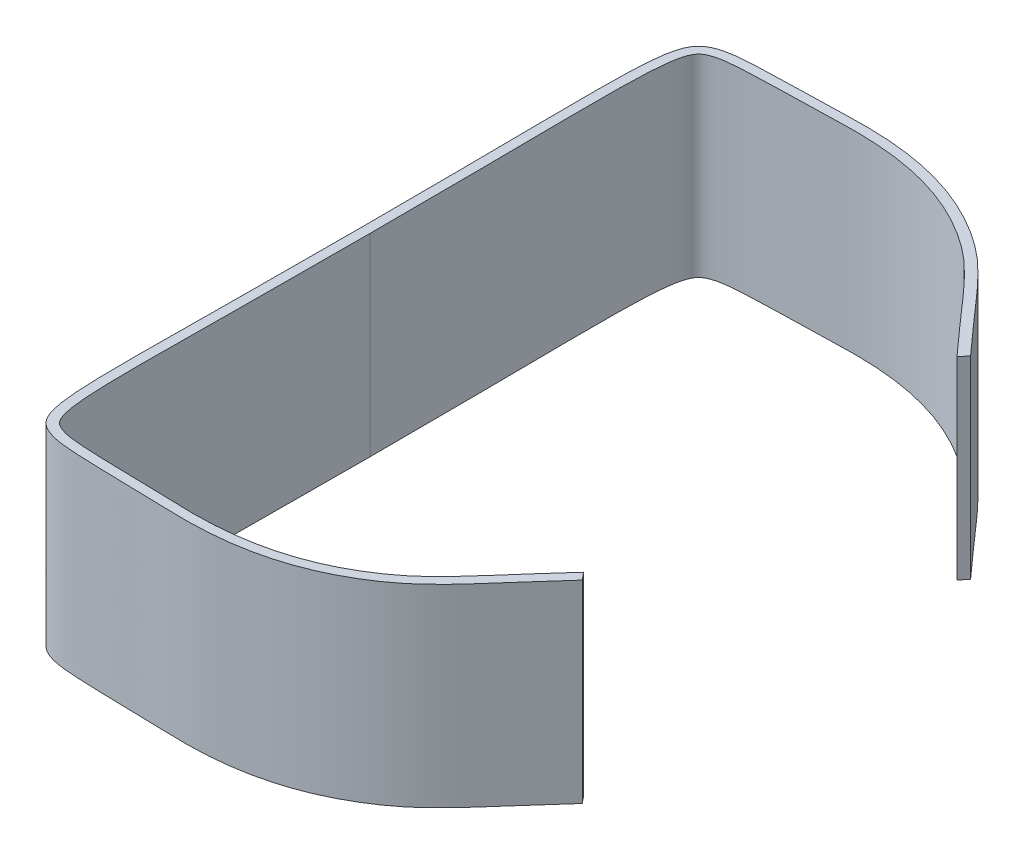
ISO-10303-21;
HEADER;
FILE_DESCRIPTION(('STEP AP214'),'2;1');
FILE_NAME('part.step','',(''),(''),'','','');
FILE_SCHEMA(('AUTOMOTIVE_DESIGN { 1 0 10303 214 1 1 1 1 }'));
ENDSEC;
DATA;
#1=APPLICATION_CONTEXT('core data for automotive mechanical design processes');
#2=APPLICATION_PROTOCOL_DEFINITION('international standard','automotive_design',2000,#1);
#3=PRODUCT_CONTEXT('',#1,'mechanical');
#4=PRODUCT('Part','Part','',(#3));
#5=PRODUCT_RELATED_PRODUCT_CATEGORY('part','',(#4));
#6=PRODUCT_DEFINITION_FORMATION('','',#4);
#7=PRODUCT_DEFINITION_CONTEXT('part definition',#1,'design');
#8=PRODUCT_DEFINITION('design','',#6,#7);
#9=PRODUCT_DEFINITION_SHAPE('','',#8);
#10=(LENGTH_UNIT() NAMED_UNIT(*) SI_UNIT(.MILLI.,.METRE.));
#11=(NAMED_UNIT(*) PLANE_ANGLE_UNIT() SI_UNIT($,.RADIAN.));
#12=(NAMED_UNIT(*) SI_UNIT($,.STERADIAN.) SOLID_ANGLE_UNIT());
#13=UNCERTAINTY_MEASURE_WITH_UNIT(LENGTH_MEASURE(1.E-05),#10,'distance_accuracy_value','');
#14=(GEOMETRIC_REPRESENTATION_CONTEXT(3) GLOBAL_UNCERTAINTY_ASSIGNED_CONTEXT((#13)) GLOBAL_UNIT_ASSIGNED_CONTEXT((#10,
#11,#12)) REPRESENTATION_CONTEXT('',''));
#15=CARTESIAN_POINT('',(0.,0.,0.));
#16=DIRECTION('',(0.,0.,1.));
#17=DIRECTION('',(1.,0.,0.));
#18=AXIS2_PLACEMENT_3D('',#15,#16,#17);
#19=CARTESIAN_POINT('',(-104.500278868593,248.550791860705,25.0692667372049));
#20=CARTESIAN_POINT('',(-104.500278868593,248.550791860705,86.2203708964296));
#21=CARTESIAN_POINT('',(-106.793117411586,248.550791860705,93.287202236139));
#22=CARTESIAN_POINT('',(-95.172272758296,248.550791860705,95.9433669146563));
#23=CARTESIAN_POINT('',(-79.469262305786,248.550791860705,96.0744979903922));
#24=CARTESIAN_POINT('',(-63.6660410291015,248.550791860705,96.7855223457146));
#25=CARTESIAN_POINT('',(-48.6034000240585,248.550791860705,94.7613497732437));
#26=CARTESIAN_POINT('',(-29.9398456370186,248.550791860705,81.0140021476635));
#27=CARTESIAN_POINT('',(-19.658840998879,248.550791860705,67.0507910474507));
#28=CARTESIAN_POINT('',(7.05130162676777,248.550791860705,41.9454729868186));
#29=CARTESIAN_POINT('',(5.29005501714887,248.550791860705,40.069266737205));
#30=CARTESIAN_POINT('',(31.3497211314067,248.550791860705,40.069266737205));
#31=B_SPLINE_CURVE_WITH_KNOTS('',3,(#19,#20,#21,#22,#23,#24,#25,#26,#27,#28,#29,#30),
.UNSPECIFIED.,.F.,.F.,(4,1,1,1,1,1,1,1,1,4),(0.,0.317927937374036,0.363507051006273,
0.445537349065021,0.481032646359293,0.682964726654727,0.721703648076661,0.829682939156698,
0.858862315487532,1.),.UNSPECIFIED.);
#32=DIRECTION('',(0.,-1.,0.));
#33=VECTOR('',#32,1.);
#34=SURFACE_OF_LINEAR_EXTRUSION('',#31,#33);
#35=CARTESIAN_POINT('',(-104.500278868593,0.,25.0692667372049));
#36=CARTESIAN_POINT('',(-104.500278868593,0.,86.2203708964296));
#37=CARTESIAN_POINT('',(-106.793117411586,0.,93.287202236139));
#38=CARTESIAN_POINT('',(-95.172272758296,0.,95.9433669146563));
#39=CARTESIAN_POINT('',(-79.469262305786,0.,96.0744979903922));
#40=CARTESIAN_POINT('',(-63.6660410291015,0.,96.7855223457146));
#41=CARTESIAN_POINT('',(-48.6034000240585,0.,94.7613497732437));
#42=CARTESIAN_POINT('',(-29.9398456370186,0.,81.0140021476635));
#43=CARTESIAN_POINT('',(-19.658840998879,0.,67.0507910474507));
#44=CARTESIAN_POINT('',(7.05130162676777,0.,41.9454729868186));
#45=CARTESIAN_POINT('',(5.29005501714887,0.,40.069266737205));
#46=CARTESIAN_POINT('',(31.3497211314067,0.,40.069266737205));
#47=B_SPLINE_CURVE_WITH_KNOTS('',3,(#35,#36,#37,#38,#39,#40,#41,#42,#43,#44,#45,#46),
.UNSPECIFIED.,.F.,.F.,(4,1,1,1,1,1,1,1,1,4),(0.,0.317927937374036,0.363507051006273,
0.445537349065021,0.481032646359293,0.682964726654727,0.721703648076661,0.829682939156698,
0.858862315487532,1.),.UNSPECIFIED.);
#48=CARTESIAN_POINT('',(-104.500278868593,0.,25.0692667372049));
#49=VERTEX_POINT('',#48);
#50=CARTESIAN_POINT('',(-17.4457507161834,0.,65.7048659966111));
#51=VERTEX_POINT('',#50);
#52=EDGE_CURVE('E110',#49,#51,#47,.T.);
#53=ORIENTED_EDGE('',*,*,#52,.T.);
#54=DIRECTION('',(0.,-1.,0.));
#55=VECTOR('',#54,1.);
#56=CARTESIAN_POINT('',(-17.4457507161834,20.25,65.7048659966111));
#57=LINE('',#56,#55);
#58=CARTESIAN_POINT('',(-17.4457507161834,40.5,65.7048659966111));
#59=VERTEX_POINT('',#58);
#60=EDGE_CURVE('E104',#51,#59,#57,.F.);
#61=ORIENTED_EDGE('',*,*,#60,.T.);
#62=CARTESIAN_POINT('',(-104.500278868593,40.5,25.0692667372049));
#63=CARTESIAN_POINT('',(-104.500278868593,40.5,86.2203708964296));
#64=CARTESIAN_POINT('',(-106.793117411586,40.5,93.287202236139));
#65=CARTESIAN_POINT('',(-95.172272758296,40.5,95.9433669146563));
#66=CARTESIAN_POINT('',(-79.469262305786,40.5,96.0744979903922));
#67=CARTESIAN_POINT('',(-63.6660410291015,40.5,96.7855223457146));
#68=CARTESIAN_POINT('',(-48.6034000240585,40.5,94.7613497732437));
#69=CARTESIAN_POINT('',(-29.9398456370186,40.5,81.0140021476635));
#70=CARTESIAN_POINT('',(-19.658840998879,40.5,67.0507910474507));
#71=CARTESIAN_POINT('',(7.05130162676777,40.5,41.9454729868186));
#72=CARTESIAN_POINT('',(5.29005501714887,40.5,40.069266737205));
#73=CARTESIAN_POINT('',(31.3497211314067,40.5,40.069266737205));
#74=B_SPLINE_CURVE_WITH_KNOTS('',3,(#62,#63,#64,#65,#66,#67,#68,#69,#70,#71,#72,#73),
.UNSPECIFIED.,.F.,.F.,(4,1,1,1,1,1,1,1,1,4),(0.,0.317927937374036,0.363507051006273,
0.445537349065021,0.481032646359293,0.682964726654727,0.721703648076661,0.829682939156698,
0.858862315487532,1.),.UNSPECIFIED.);
#75=CARTESIAN_POINT('',(-104.500278868593,40.5,25.0692667372051));
#76=VERTEX_POINT('',#75);
#77=EDGE_CURVE('E138',#76,#59,#74,.T.);
#78=ORIENTED_EDGE('',*,*,#77,.F.);
#79=DIRECTION('',(0.,-1.,0.));
#80=VECTOR('',#79,1.);
#81=CARTESIAN_POINT('',(-104.500278868593,248.550791860705,25.0692667372049));
#82=LINE('',#81,#80);
#83=EDGE_CURVE('E113',#76,#49,#82,.T.);
#84=ORIENTED_EDGE('',*,*,#83,.T.);
#85=EDGE_LOOP('',(#53,#61,#78,#84));
#86=FACE_BOUND('',#85,.T.);
#87=ADVANCED_FACE('F38',(#86),#34,.F.);
#88=CARTESIAN_POINT('',(31.3497211314067,248.550791860705,10.069266737205));
#89=CARTESIAN_POINT('',(5.29005501714887,248.550791860705,10.069266737205));
#90=CARTESIAN_POINT('',(7.05130162676776,248.550791860705,8.19306048759136));
#91=CARTESIAN_POINT('',(-19.658840998879,248.550791860705,-16.9122575730407));
#92=CARTESIAN_POINT('',(-29.9398456370186,248.550791860705,-30.8754686732535));
#93=CARTESIAN_POINT('',(-48.6034000240585,248.550791860705,-44.6228162988337));
#94=CARTESIAN_POINT('',(-63.6660410291015,248.550791860705,-46.6469888713046));
#95=CARTESIAN_POINT('',(-79.469262305786,248.550791860705,-45.9359645159822));
#96=CARTESIAN_POINT('',(-95.172272758296,248.550791860705,-45.8048334402463));
#97=CARTESIAN_POINT('',(-106.793117411586,248.550791860705,-43.148668761729));
#98=CARTESIAN_POINT('',(-104.500278868593,248.550791860705,-36.0818374220196));
#99=CARTESIAN_POINT('',(-104.500278868593,248.550791860705,25.0692667372051));
#100=B_SPLINE_CURVE_WITH_KNOTS('',3,(#88,#89,#90,#91,#92,#93,#94,#95,#96,#97,#98,#99),
.UNSPECIFIED.,.F.,.F.,(4,1,1,1,1,1,1,1,1,4),(0.,0.141137684512468,0.170317060843302,
0.278296351923339,0.317035273345273,0.518967353640707,0.554462650934979,0.636492948993727,
0.682072062625964,1.),.UNSPECIFIED.);
#101=DIRECTION('',(0.,-1.,0.));
#102=VECTOR('',#101,1.);
#103=SURFACE_OF_LINEAR_EXTRUSION('',#100,#102);
#104=CARTESIAN_POINT('',(31.3497211314067,40.5,10.069266737205));
#105=CARTESIAN_POINT('',(5.29005501714887,40.5,10.069266737205));
#106=CARTESIAN_POINT('',(7.05130162676776,40.5,8.19306048759136));
#107=CARTESIAN_POINT('',(-19.658840998879,40.5,-16.9122575730407));
#108=CARTESIAN_POINT('',(-29.9398456370186,40.5,-30.8754686732535));
#109=CARTESIAN_POINT('',(-48.6034000240585,40.5,-44.6228162988337));
#110=CARTESIAN_POINT('',(-63.6660410291015,40.5,-46.6469888713046));
#111=CARTESIAN_POINT('',(-79.469262305786,40.5,-45.9359645159822));
#112=CARTESIAN_POINT('',(-95.172272758296,40.5,-45.8048334402463));
#113=CARTESIAN_POINT('',(-106.793117411586,40.5,-43.148668761729));
#114=CARTESIAN_POINT('',(-104.500278868593,40.5,-36.0818374220196));
#115=CARTESIAN_POINT('',(-104.500278868593,40.5,25.0692667372051));
#116=B_SPLINE_CURVE_WITH_KNOTS('',3,(#104,#105,#106,#107,#108,#109,#110,#111,#112,#113,#114,
#115),.UNSPECIFIED.,.F.,.F.,(4,1,1,1,1,1,1,1,1,4),(0.,0.141137684512468,0.170317060843302,
0.278296351923339,0.317035273345273,0.518967353640707,0.554462650934979,0.636492948993727,
0.682072062625964,1.),.UNSPECIFIED.);
#117=CARTESIAN_POINT('',(-17.4457507161834,40.5,-15.5663325222011));
#118=VERTEX_POINT('',#117);
#119=EDGE_CURVE('E103',#118,#76,#116,.T.);
#120=ORIENTED_EDGE('',*,*,#119,.F.);
#121=DIRECTION('',(0.,-1.,0.));
#122=VECTOR('',#121,1.);
#123=CARTESIAN_POINT('',(-17.4457507161834,20.25,-15.5663325222011));
#124=LINE('',#123,#122);
#125=CARTESIAN_POINT('',(-17.4457507161834,0.,-15.5663325222011));
#126=VERTEX_POINT('',#125);
#127=EDGE_CURVE('E54',#118,#126,#124,.T.);
#128=ORIENTED_EDGE('',*,*,#127,.T.);
#129=CARTESIAN_POINT('',(31.3497211314067,0.,10.069266737205));
#130=CARTESIAN_POINT('',(5.29005501714887,0.,10.069266737205));
#131=CARTESIAN_POINT('',(7.05130162676776,0.,8.19306048759136));
#132=CARTESIAN_POINT('',(-19.658840998879,0.,-16.9122575730407));
#133=CARTESIAN_POINT('',(-29.9398456370186,0.,-30.8754686732535));
#134=CARTESIAN_POINT('',(-48.6034000240585,0.,-44.6228162988337));
#135=CARTESIAN_POINT('',(-63.6660410291015,0.,-46.6469888713046));
#136=CARTESIAN_POINT('',(-79.469262305786,0.,-45.9359645159822));
#137=CARTESIAN_POINT('',(-95.172272758296,0.,-45.8048334402463));
#138=CARTESIAN_POINT('',(-106.793117411586,0.,-43.148668761729));
#139=CARTESIAN_POINT('',(-104.500278868593,0.,-36.0818374220196));
#140=CARTESIAN_POINT('',(-104.500278868593,0.,25.0692667372051));
#141=B_SPLINE_CURVE_WITH_KNOTS('',3,(#129,#130,#131,#132,#133,#134,#135,#136,#137,#138,#139,
#140),.UNSPECIFIED.,.F.,.F.,(4,1,1,1,1,1,1,1,1,4),(0.,0.141137684512468,0.170317060843302,
0.278296351923339,0.317035273345273,0.518967353640707,0.554462650934979,0.636492948993727,
0.682072062625964,1.),.UNSPECIFIED.);
#142=EDGE_CURVE('E101',#126,#49,#141,.T.);
#143=ORIENTED_EDGE('',*,*,#142,.T.);
#144=ORIENTED_EDGE('',*,*,#83,.F.);
#145=EDGE_LOOP('',(#120,#128,#143,#144));
#146=FACE_BOUND('',#145,.T.);
#147=ADVANCED_FACE('F40',(#146),#103,.F.);
#148=CARTESIAN_POINT('',(-68.9923316694651,0.,-46.2246215981284));
#149=DIRECTION('',(0.,1.,0.));
#150=DIRECTION('',(0.,0.,1.));
#151=AXIS2_PLACEMENT_3D('',#148,#149,#150);
#152=PLANE('',#151);
#153=ORIENTED_EDGE('',*,*,#142,.F.);
#154=CARTESIAN_POINT('',(31.3497211314067,0.,25.069266737205));
#155=DIRECTION('',(0.,1.,0.));
#156=DIRECTION('',(0.,0.,1.));
#157=AXIS2_PLACEMENT_3D('',#154,#155,#156);
#158=CIRCLE('',#157,63.5);
#159=CARTESIAN_POINT('',(-18.7147392360709,0.,-13.9922207935236));
#160=VERTEX_POINT('',#159);
#161=EDGE_CURVE('E89',#126,#160,#158,.T.);
#162=ORIENTED_EDGE('',*,*,#161,.T.);
#163=CARTESIAN_POINT('',(31.3497211314067,0.,12.069266737205));
#164=CARTESIAN_POINT('',(30.6467718543112,0.,12.069266737205));
#165=CARTESIAN_POINT('',(29.2114531936166,0.,12.0668777775646));
#166=CARTESIAN_POINT('',(27.2350158500333,0.,12.0551261718132));
#167=CARTESIAN_POINT('',(25.3573795729473,0.,12.0341953276854));
#168=CARTESIAN_POINT('',(23.0040571351233,0.,11.9926774415696));
#169=CARTESIAN_POINT('',(20.3185239243081,0.,11.9126630931522));
#170=CARTESIAN_POINT('',(17.4651119758886,0.,11.76294117911));
#171=CARTESIAN_POINT('',(14.9348603645907,0.,11.5500626602896));
#172=CARTESIAN_POINT('',(11.9327593169538,0.,11.1676435596618));
#173=CARTESIAN_POINT('',(8.76339977324109,0.,10.4751316264119));
#174=CARTESIAN_POINT('',(5.59385851988909,0.,9.18832362157286));
#175=CARTESIAN_POINT('',(2.88150265345503,0.,7.41066052437564));
#176=CARTESIAN_POINT('',(0.395728613533612,0.,5.20592588600096));
#177=CARTESIAN_POINT('',(-2.23210571256994,0.,2.54756809751704));
#178=CARTESIAN_POINT('',(-5.35667563862406,0.,-0.645706558347562));
#179=CARTESIAN_POINT('',(-9.41246816280954,0.,-4.53754485598129));
#180=CARTESIAN_POINT('',(-13.7609204954448,0.,-8.75785002419778));
#181=CARTESIAN_POINT('',(-17.686786151176,0.,-12.850925112658));
#182=CARTESIAN_POINT('',(-21.2594441704765,0.,-16.7717781626167));
#183=CARTESIAN_POINT('',(-25.609260401534,0.,-21.7087772187235));
#184=CARTESIAN_POINT('',(-30.4043140668278,0.,-27.2347637484207));
#185=CARTESIAN_POINT('',(-35.4509761034591,0.,-32.402322376408));
#186=CARTESIAN_POINT('',(-40.234966672972,0.,-35.9702422205511));
#187=CARTESIAN_POINT('',(-45.0956882092921,0.,-38.7908005733552));
#188=CARTESIAN_POINT('',(-49.9382311367634,0.,-40.9204499363347));
#189=CARTESIAN_POINT('',(-54.7711390861764,0.,-42.4535611327101));
#190=CARTESIAN_POINT('',(-59.5761259023535,0.,-43.4700334528744));
#191=CARTESIAN_POINT('',(-63.5451146220021,0.,-43.9532577071498));
#192=CARTESIAN_POINT('',(-66.6901463295852,0.,-44.1607315447825));
#193=CARTESIAN_POINT('',(-69.0302854955751,0.,-44.2365159530004));
#194=CARTESIAN_POINT('',(-71.3533823716473,0.,-44.2427838054974));
#195=CARTESIAN_POINT('',(-73.6409169166751,0.,-44.1878101547645));
#196=CARTESIAN_POINT('',(-76.1321912767981,0.,-44.0974056444901));
#197=CARTESIAN_POINT('',(-79.1487937535476,0.,-44.0116046749307));
#198=CARTESIAN_POINT('',(-82.6311297644543,0.,-43.9404272923477));
#199=CARTESIAN_POINT('',(-86.2768320082327,0.,-43.8639059537216));
#200=CARTESIAN_POINT('',(-89.8290058547577,0.,-43.7688906179447));
#201=CARTESIAN_POINT('',(-93.0248270177282,0.,-43.640829485382));
#202=CARTESIAN_POINT('',(-95.5383032374088,0.,-43.467627657293));
#203=CARTESIAN_POINT('',(-97.2067048497861,0.,-43.2451850641316));
#204=CARTESIAN_POINT('',(-98.2950047185534,0.,-42.9980167354465));
#205=CARTESIAN_POINT('',(-99.1660567557545,0.,-42.7038279086618));
#206=CARTESIAN_POINT('',(-99.8641741607911,0.,-42.3894748615935));
#207=CARTESIAN_POINT('',(-100.3676620088,0.,-42.0597597200759));
#208=CARTESIAN_POINT('',(-100.764802453963,0.,-41.6822409888388));
#209=CARTESIAN_POINT('',(-101.254364747512,0.,-40.9991267202523));
#210=CARTESIAN_POINT('',(-101.853156267838,0.,-39.5166319169307));
#211=CARTESIAN_POINT('',(-102.38373617139,0.,-36.3277896355441));
#212=CARTESIAN_POINT('',(-102.679368896636,0.,-31.568606119285));
#213=CARTESIAN_POINT('',(-102.783388859365,0.,-25.0124678561875));
#214=CARTESIAN_POINT('',(-102.758141912572,0.,-17.8376665631294));
#215=CARTESIAN_POINT('',(-102.701925385238,0.,-10.9332384190125));
#216=CARTESIAN_POINT('',(-102.649578735497,0.,-5.13734486041059));
#217=CARTESIAN_POINT('',(-102.594900900551,0.,1.31172538004062));
#218=CARTESIAN_POINT('',(-102.553939485303,0.,7.25986953130089));
#219=CARTESIAN_POINT('',(-102.527860161789,0.,12.3812635229994));
#220=CARTESIAN_POINT('',(-102.512627235922,0.,16.4068986979431));
#221=CARTESIAN_POINT('',(-102.504356561132,0.,19.9238058886529));
#222=CARTESIAN_POINT('',(-102.500884757049,0.,22.8265075412887));
#223=CARTESIAN_POINT('',(-102.500278868593,0.,24.3256640897824));
#224=CARTESIAN_POINT('',(-102.500278868593,0.,25.0692667372051));
#225=B_SPLINE_CURVE_WITH_KNOTS('',3,(#163,#164,#165,#166,#167,#168,#169,#170,#171,#172,#173,
#174,#175,#176,#177,#178,#179,#180,#181,#182,#183,#184,#185,#186,#187,#188,#189,#190,#191,#192,
#193,#194,#195,#196,#197,#198,#199,#200,#201,#202,#203,#204,#205,#206,#207,#208,#209,#210,#211,
#212,#213,#214,#215,#216,#217,#218,#219,#220,#221,#222,#223,#224),.UNSPECIFIED.,.F.,.F.,(4,1,1,
1,1,1,1,1,1,1,1,1,1,1,1,1,1,1,1,1,1,1,1,1,1,1,1,1,1,1,1,1,1,1,1,1,1,1,1,1,1,1,1,1,1,1,1,1,1,1,1,
1,1,1,1,1,1,1,1,4),(0.,0.00390625,0.0078125,0.01171875,0.015625,0.0234375,0.03125,0.0390625,
0.046875,0.0625,0.078125,0.09375,0.109375,0.125,0.140625,0.15625,0.171875,0.1875,0.203125,
0.21875,0.25,0.28125,0.3125,0.34375,0.375,0.40625,0.4375,0.46875,0.484375,0.5,0.515625,0.53125,
0.546875,0.5625,0.578125,0.59375,0.609375,0.625,0.640625,0.65625,0.671875,0.6875,0.703125,
0.71875,0.734375,0.75,0.78125,0.8125,0.84375,0.875,0.90625,0.921875,0.9375,0.953125,0.96875,
0.9765625,0.984375,0.9921875,0.99609375,1.),.UNSPECIFIED.);
#226=CARTESIAN_POINT('',(-102.500278868593,0.,25.0692667372051));
#227=VERTEX_POINT('',#226);
#228=EDGE_CURVE('E116',#160,#227,#225,.T.);
#229=ORIENTED_EDGE('',*,*,#228,.T.);
#230=CARTESIAN_POINT('',(-102.500278868593,0.,25.0692667372049));
#231=CARTESIAN_POINT('',(-102.500278868593,0.,25.8128693846276));
#232=CARTESIAN_POINT('',(-102.500884757049,0.,27.3120259331213));
#233=CARTESIAN_POINT('',(-102.504356561132,0.,30.2147275857571));
#234=CARTESIAN_POINT('',(-102.512627235922,0.,33.7316347764669));
#235=CARTESIAN_POINT('',(-102.527860161789,0.,37.7572699514106));
#236=CARTESIAN_POINT('',(-102.553939485303,0.,42.8786639431091));
#237=CARTESIAN_POINT('',(-102.594900900551,0.,48.8268080943694));
#238=CARTESIAN_POINT('',(-102.649578735497,0.,55.2758783348206));
#239=CARTESIAN_POINT('',(-102.701925385238,0.,61.0717718934225));
#240=CARTESIAN_POINT('',(-102.758141912572,0.,67.9762000375394));
#241=CARTESIAN_POINT('',(-102.783388859365,0.,75.1510013305975));
#242=CARTESIAN_POINT('',(-102.679368896636,0.,81.707139593695));
#243=CARTESIAN_POINT('',(-102.38373617139,0.,86.4663231099541));
#244=CARTESIAN_POINT('',(-101.853156267838,0.,89.6551653913407));
#245=CARTESIAN_POINT('',(-101.254364747512,0.,91.1376601946623));
#246=CARTESIAN_POINT('',(-100.764802453963,0.,91.8207744632489));
#247=CARTESIAN_POINT('',(-100.3676620088,0.,92.1982931944859));
#248=CARTESIAN_POINT('',(-99.8641741607911,0.,92.5280083360036));
#249=CARTESIAN_POINT('',(-99.1660567557545,0.,92.8423613830718));
#250=CARTESIAN_POINT('',(-98.2950047185533,0.,93.1365502098566));
#251=CARTESIAN_POINT('',(-97.2067048497861,0.,93.3837185385416));
#252=CARTESIAN_POINT('',(-95.5383032374087,0.,93.606161131703));
#253=CARTESIAN_POINT('',(-93.0248270177281,0.,93.7793629597921));
#254=CARTESIAN_POINT('',(-89.8290058547577,0.,93.9074240923547));
#255=CARTESIAN_POINT('',(-86.2768320082327,0.,94.0024394281317));
#256=CARTESIAN_POINT('',(-82.6311297644543,0.,94.0789607667577));
#257=CARTESIAN_POINT('',(-79.1487937535476,0.,94.1501381493407));
#258=CARTESIAN_POINT('',(-76.1321912767981,0.,94.2359391189001));
#259=CARTESIAN_POINT('',(-73.6409169166751,0.,94.3263436291746));
#260=CARTESIAN_POINT('',(-71.3533823716473,0.,94.3813172799074));
#261=CARTESIAN_POINT('',(-69.0302854955751,0.,94.3750494274104));
#262=CARTESIAN_POINT('',(-66.6901463295852,0.,94.2992650191925));
#263=CARTESIAN_POINT('',(-63.5451146220021,0.,94.0917911815598));
#264=CARTESIAN_POINT('',(-59.5761259023535,0.,93.6085669272844));
#265=CARTESIAN_POINT('',(-54.7711390861764,0.,92.5920946071201));
#266=CARTESIAN_POINT('',(-49.9382311367634,0.,91.0589834107447));
#267=CARTESIAN_POINT('',(-45.0956882092921,0.,88.9293340477652));
#268=CARTESIAN_POINT('',(-40.234966672972,0.,86.1087756949611));
#269=CARTESIAN_POINT('',(-35.4509761034591,0.,82.5408558508179));
#270=CARTESIAN_POINT('',(-30.4043140668277,0.,77.3732972228307));
#271=CARTESIAN_POINT('',(-25.609260401534,0.,71.8473106931335));
#272=CARTESIAN_POINT('',(-21.2594441704764,0.,66.9103116370267));
#273=CARTESIAN_POINT('',(-17.686786151176,0.,62.989458587068));
#274=CARTESIAN_POINT('',(-13.7609204954448,0.,58.8963834986078));
#275=CARTESIAN_POINT('',(-9.41246816280953,0.,54.6760783303913));
#276=CARTESIAN_POINT('',(-5.35667563862406,0.,50.7842400327576));
#277=CARTESIAN_POINT('',(-2.23210571256994,0.,47.590965376893));
#278=CARTESIAN_POINT('',(0.395728613533615,0.,44.932607588409));
#279=CARTESIAN_POINT('',(2.88150265345504,0.,42.7278729500344));
#280=CARTESIAN_POINT('',(5.59385851988909,0.,40.9502098528371));
#281=CARTESIAN_POINT('',(8.7633997732411,0.,39.6634018479981));
#282=CARTESIAN_POINT('',(11.9327593169538,0.,38.9708899147482));
#283=CARTESIAN_POINT('',(14.9348603645907,0.,38.5884708141204));
#284=CARTESIAN_POINT('',(17.4651119758886,0.,38.3755922953));
#285=CARTESIAN_POINT('',(20.3185239243081,0.,38.2258703812578));
#286=CARTESIAN_POINT('',(23.0040571351233,0.,38.1458560328405));
#287=CARTESIAN_POINT('',(25.3573795729474,0.,38.1043381467246));
#288=CARTESIAN_POINT('',(27.2350158500333,0.,38.0834073025968));
#289=CARTESIAN_POINT('',(29.2114531936166,0.,38.0716556968454));
#290=CARTESIAN_POINT('',(30.6467718543112,0.,38.069266737205));
#291=CARTESIAN_POINT('',(31.3497211314067,0.,38.069266737205));
#292=B_SPLINE_CURVE_WITH_KNOTS('',3,(#230,#231,#232,#233,#234,#235,#236,#237,#238,#239,#240,
#241,#242,#243,#244,#245,#246,#247,#248,#249,#250,#251,#252,#253,#254,#255,#256,#257,#258,#259,
#260,#261,#262,#263,#264,#265,#266,#267,#268,#269,#270,#271,#272,#273,#274,#275,#276,#277,#278,
#279,#280,#281,#282,#283,#284,#285,#286,#287,#288,#289,#290,#291),.UNSPECIFIED.,.F.,.F.,(4,1,1,
1,1,1,1,1,1,1,1,1,1,1,1,1,1,1,1,1,1,1,1,1,1,1,1,1,1,1,1,1,1,1,1,1,1,1,1,1,1,1,1,1,1,1,1,1,1,1,1,
1,1,1,1,1,1,1,1,4),(0.,0.00390625,0.0078125,0.015625,0.0234375,0.03125,0.046875,0.0625,0.078125,
0.09375,0.125,0.15625,0.1875,0.21875,0.25,0.265625,0.28125,0.296875,0.3125,0.328125,0.34375,
0.359375,0.375,0.390625,0.40625,0.421875,0.4375,0.453125,0.46875,0.484375,0.5,0.515625,0.53125,
0.5625,0.59375,0.625,0.65625,0.6875,0.71875,0.75,0.78125,0.796875,0.8125,0.828125,0.84375,
0.859375,0.875,0.890625,0.90625,0.921875,0.9375,0.953125,0.9609375,0.96875,0.9765625,0.984375,
0.98828125,0.9921875,0.99609375,1.),.UNSPECIFIED.);
#293=CARTESIAN_POINT('',(-18.7147392360709,0.,64.1307542679336));
#294=VERTEX_POINT('',#293);
#295=EDGE_CURVE('E195',#227,#294,#292,.T.);
#296=ORIENTED_EDGE('',*,*,#295,.T.);
#297=EDGE_CURVE('E96',#294,#51,#158,.T.);
#298=ORIENTED_EDGE('',*,*,#297,.T.);
#299=ORIENTED_EDGE('',*,*,#52,.F.);
#300=EDGE_LOOP('',(#153,#162,#229,#296,#298,#299));
#301=FACE_BOUND('',#300,.T.);
#302=ADVANCED_FACE('F107',(#301),#152,.F.);
#303=CARTESIAN_POINT('',(31.3497211314067,248.550791860705,12.069266737205));
#304=CARTESIAN_POINT('',(30.6467718543112,248.550791860705,12.069266737205));
#305=CARTESIAN_POINT('',(29.2114531936166,248.550791860705,12.0668777775646));
#306=CARTESIAN_POINT('',(27.2350158500333,248.550791860705,12.0551261718132));
#307=CARTESIAN_POINT('',(25.3573795729473,248.550791860705,12.0341953276854));
#308=CARTESIAN_POINT('',(23.0040571351233,248.550791860705,11.9926774415696));
#309=CARTESIAN_POINT('',(20.3185239243081,248.550791860705,11.9126630931522));
#310=CARTESIAN_POINT('',(17.4651119758886,248.550791860705,11.76294117911));
#311=CARTESIAN_POINT('',(14.9348603645907,248.550791860705,11.5500626602896));
#312=CARTESIAN_POINT('',(11.9327593169538,248.550791860705,11.1676435596618));
#313=CARTESIAN_POINT('',(8.76339977324109,248.550791860705,10.4751316264119));
#314=CARTESIAN_POINT('',(5.59385851988909,248.550791860705,9.18832362157286));
#315=CARTESIAN_POINT('',(2.88150265345503,248.550791860705,7.41066052437564));
#316=CARTESIAN_POINT('',(0.395728613533612,248.550791860705,5.20592588600096));
#317=CARTESIAN_POINT('',(-2.23210571256994,248.550791860705,2.54756809751704));
#318=CARTESIAN_POINT('',(-5.35667563862406,248.550791860705,-0.645706558347562));
#319=CARTESIAN_POINT('',(-9.41246816280954,248.550791860705,-4.53754485598129));
#320=CARTESIAN_POINT('',(-13.7609204954448,248.550791860705,-8.75785002419778));
#321=CARTESIAN_POINT('',(-17.686786151176,248.550791860705,-12.850925112658));
#322=CARTESIAN_POINT('',(-21.2594441704765,248.550791860705,-16.7717781626167));
#323=CARTESIAN_POINT('',(-25.609260401534,248.550791860705,-21.7087772187235));
#324=CARTESIAN_POINT('',(-30.4043140668278,248.550791860705,-27.2347637484207));
#325=CARTESIAN_POINT('',(-35.4509761034591,248.550791860705,-32.402322376408));
#326=CARTESIAN_POINT('',(-40.234966672972,248.550791860705,-35.9702422205511));
#327=CARTESIAN_POINT('',(-45.0956882092921,248.550791860705,-38.7908005733552));
#328=CARTESIAN_POINT('',(-49.9382311367634,248.550791860705,-40.9204499363347));
#329=CARTESIAN_POINT('',(-54.7711390861764,248.550791860705,-42.4535611327101));
#330=CARTESIAN_POINT('',(-59.5761259023535,248.550791860705,-43.4700334528744));
#331=CARTESIAN_POINT('',(-63.5451146220021,248.550791860705,-43.9532577071498));
#332=CARTESIAN_POINT('',(-66.6901463295852,248.550791860705,-44.1607315447825));
#333=CARTESIAN_POINT('',(-69.0302854955751,248.550791860705,-44.2365159530004));
#334=CARTESIAN_POINT('',(-71.3533823716473,248.550791860705,-44.2427838054974));
#335=CARTESIAN_POINT('',(-73.6409169166751,248.550791860705,-44.1878101547645));
#336=CARTESIAN_POINT('',(-76.1321912767981,248.550791860705,-44.0974056444901));
#337=CARTESIAN_POINT('',(-79.1487937535476,248.550791860705,-44.0116046749307));
#338=CARTESIAN_POINT('',(-82.6311297644543,248.550791860705,-43.9404272923477));
#339=CARTESIAN_POINT('',(-86.2768320082327,248.550791860705,-43.8639059537216));
#340=CARTESIAN_POINT('',(-89.8290058547577,248.550791860705,-43.7688906179447));
#341=CARTESIAN_POINT('',(-93.0248270177282,248.550791860705,-43.640829485382));
#342=CARTESIAN_POINT('',(-95.5383032374088,248.550791860705,-43.467627657293));
#343=CARTESIAN_POINT('',(-97.2067048497861,248.550791860705,-43.2451850641316));
#344=CARTESIAN_POINT('',(-98.2950047185534,248.550791860705,-42.9980167354465));
#345=CARTESIAN_POINT('',(-99.1660567557545,248.550791860705,-42.7038279086618));
#346=CARTESIAN_POINT('',(-99.8641741607911,248.550791860705,-42.3894748615935));
#347=CARTESIAN_POINT('',(-100.3676620088,248.550791860705,-42.0597597200759));
#348=CARTESIAN_POINT('',(-100.764802453963,248.550791860705,-41.6822409888388));
#349=CARTESIAN_POINT('',(-101.254364747512,248.550791860705,-40.9991267202523));
#350=CARTESIAN_POINT('',(-101.853156267838,248.550791860705,-39.5166319169307));
#351=CARTESIAN_POINT('',(-102.38373617139,248.550791860705,-36.3277896355441));
#352=CARTESIAN_POINT('',(-102.679368896636,248.550791860705,-31.568606119285));
#353=CARTESIAN_POINT('',(-102.783388859365,248.550791860705,-25.0124678561875));
#354=CARTESIAN_POINT('',(-102.758141912572,248.550791860705,-17.8376665631294));
#355=CARTESIAN_POINT('',(-102.701925385238,248.550791860705,-10.9332384190125));
#356=CARTESIAN_POINT('',(-102.649578735497,248.550791860705,-5.13734486041059));
#357=CARTESIAN_POINT('',(-102.594900900551,248.550791860705,1.31172538004062));
#358=CARTESIAN_POINT('',(-102.553939485303,248.550791860705,7.25986953130089));
#359=CARTESIAN_POINT('',(-102.527860161789,248.550791860705,12.3812635229994));
#360=CARTESIAN_POINT('',(-102.512627235922,248.550791860705,16.4068986979431));
#361=CARTESIAN_POINT('',(-102.504356561132,248.550791860705,19.9238058886529));
#362=CARTESIAN_POINT('',(-102.500884757049,248.550791860705,22.8265075412887));
#363=CARTESIAN_POINT('',(-102.500278868593,248.550791860705,24.3256640897824));
#364=CARTESIAN_POINT('',(-102.500278868593,248.550791860705,25.0692667372051));
#365=B_SPLINE_CURVE_WITH_KNOTS('',3,(#303,#304,#305,#306,#307,#308,#309,#310,#311,#312,#313,
#314,#315,#316,#317,#318,#319,#320,#321,#322,#323,#324,#325,#326,#327,#328,#329,#330,#331,#332,
#333,#334,#335,#336,#337,#338,#339,#340,#341,#342,#343,#344,#345,#346,#347,#348,#349,#350,#351,
#352,#353,#354,#355,#356,#357,#358,#359,#360,#361,#362,#363,#364),.UNSPECIFIED.,.F.,.F.,(4,1,1,
1,1,1,1,1,1,1,1,1,1,1,1,1,1,1,1,1,1,1,1,1,1,1,1,1,1,1,1,1,1,1,1,1,1,1,1,1,1,1,1,1,1,1,1,1,1,1,1,
1,1,1,1,1,1,1,1,4),(0.,0.00390625,0.0078125,0.01171875,0.015625,0.0234375,0.03125,0.0390625,
0.046875,0.0625,0.078125,0.09375,0.109375,0.125,0.140625,0.15625,0.171875,0.1875,0.203125,
0.21875,0.25,0.28125,0.3125,0.34375,0.375,0.40625,0.4375,0.46875,0.484375,0.5,0.515625,0.53125,
0.546875,0.5625,0.578125,0.59375,0.609375,0.625,0.640625,0.65625,0.671875,0.6875,0.703125,
0.71875,0.734375,0.75,0.78125,0.8125,0.84375,0.875,0.90625,0.921875,0.9375,0.953125,0.96875,
0.9765625,0.984375,0.9921875,0.99609375,1.),.UNSPECIFIED.);
#366=DIRECTION('',(0.,-1.,0.));
#367=VECTOR('',#366,1.);
#368=SURFACE_OF_LINEAR_EXTRUSION('',#365,#367);
#369=DIRECTION('',(0.,-1.,0.));
#370=VECTOR('',#369,1.);
#371=CARTESIAN_POINT('',(-18.7147392360709,20.25,-13.9922207935236));
#372=LINE('',#371,#370);
#373=CARTESIAN_POINT('',(-18.7147392360709,40.5,-13.9922207935236));
#374=VERTEX_POINT('',#373);
#375=EDGE_CURVE('E92',#374,#160,#372,.T.);
#376=ORIENTED_EDGE('',*,*,#375,.F.);
#377=CARTESIAN_POINT('',(31.3497211314067,40.5,12.069266737205));
#378=CARTESIAN_POINT('',(30.6467718543112,40.5,12.069266737205));
#379=CARTESIAN_POINT('',(29.2114531936166,40.5,12.0668777775646));
#380=CARTESIAN_POINT('',(27.2350158500333,40.5,12.0551261718132));
#381=CARTESIAN_POINT('',(25.3573795729473,40.5,12.0341953276854));
#382=CARTESIAN_POINT('',(23.0040571351233,40.5,11.9926774415696));
#383=CARTESIAN_POINT('',(20.3185239243081,40.5,11.9126630931522));
#384=CARTESIAN_POINT('',(17.4651119758886,40.5,11.76294117911));
#385=CARTESIAN_POINT('',(14.9348603645907,40.5,11.5500626602896));
#386=CARTESIAN_POINT('',(11.9327593169538,40.5,11.1676435596618));
#387=CARTESIAN_POINT('',(8.76339977324109,40.5,10.4751316264119));
#388=CARTESIAN_POINT('',(5.59385851988909,40.5,9.18832362157286));
#389=CARTESIAN_POINT('',(2.88150265345503,40.5,7.41066052437564));
#390=CARTESIAN_POINT('',(0.395728613533612,40.5,5.20592588600096));
#391=CARTESIAN_POINT('',(-2.23210571256994,40.5,2.54756809751704));
#392=CARTESIAN_POINT('',(-5.35667563862406,40.5,-0.645706558347562));
#393=CARTESIAN_POINT('',(-9.41246816280954,40.5,-4.53754485598129));
#394=CARTESIAN_POINT('',(-13.7609204954448,40.5,-8.75785002419778));
#395=CARTESIAN_POINT('',(-17.686786151176,40.5,-12.850925112658));
#396=CARTESIAN_POINT('',(-21.2594441704765,40.5,-16.7717781626167));
#397=CARTESIAN_POINT('',(-25.609260401534,40.5,-21.7087772187235));
#398=CARTESIAN_POINT('',(-30.4043140668278,40.5,-27.2347637484207));
#399=CARTESIAN_POINT('',(-35.4509761034591,40.5,-32.402322376408));
#400=CARTESIAN_POINT('',(-40.234966672972,40.5,-35.9702422205511));
#401=CARTESIAN_POINT('',(-45.0956882092921,40.5,-38.7908005733552));
#402=CARTESIAN_POINT('',(-49.9382311367634,40.5,-40.9204499363347));
#403=CARTESIAN_POINT('',(-54.7711390861764,40.5,-42.4535611327101));
#404=CARTESIAN_POINT('',(-59.5761259023535,40.5,-43.4700334528744));
#405=CARTESIAN_POINT('',(-63.5451146220021,40.5,-43.9532577071498));
#406=CARTESIAN_POINT('',(-66.6901463295852,40.5,-44.1607315447825));
#407=CARTESIAN_POINT('',(-69.0302854955751,40.5,-44.2365159530004));
#408=CARTESIAN_POINT('',(-71.3533823716473,40.5,-44.2427838054974));
#409=CARTESIAN_POINT('',(-73.6409169166751,40.5,-44.1878101547645));
#410=CARTESIAN_POINT('',(-76.1321912767981,40.5,-44.0974056444901));
#411=CARTESIAN_POINT('',(-79.1487937535476,40.5,-44.0116046749307));
#412=CARTESIAN_POINT('',(-82.6311297644543,40.5,-43.9404272923477));
#413=CARTESIAN_POINT('',(-86.2768320082327,40.5,-43.8639059537216));
#414=CARTESIAN_POINT('',(-89.8290058547577,40.5,-43.7688906179447));
#415=CARTESIAN_POINT('',(-93.0248270177282,40.5,-43.640829485382));
#416=CARTESIAN_POINT('',(-95.5383032374088,40.5,-43.467627657293));
#417=CARTESIAN_POINT('',(-97.2067048497861,40.5,-43.2451850641316));
#418=CARTESIAN_POINT('',(-98.2950047185534,40.5,-42.9980167354465));
#419=CARTESIAN_POINT('',(-99.1660567557545,40.5,-42.7038279086618));
#420=CARTESIAN_POINT('',(-99.8641741607911,40.5,-42.3894748615935));
#421=CARTESIAN_POINT('',(-100.3676620088,40.5,-42.0597597200759));
#422=CARTESIAN_POINT('',(-100.764802453963,40.5,-41.6822409888388));
#423=CARTESIAN_POINT('',(-101.254364747512,40.5,-40.9991267202523));
#424=CARTESIAN_POINT('',(-101.853156267838,40.5,-39.5166319169307));
#425=CARTESIAN_POINT('',(-102.38373617139,40.5,-36.3277896355441));
#426=CARTESIAN_POINT('',(-102.679368896636,40.5,-31.568606119285));
#427=CARTESIAN_POINT('',(-102.783388859365,40.5,-25.0124678561875));
#428=CARTESIAN_POINT('',(-102.758141912572,40.5,-17.8376665631294));
#429=CARTESIAN_POINT('',(-102.701925385238,40.5,-10.9332384190125));
#430=CARTESIAN_POINT('',(-102.649578735497,40.5,-5.13734486041059));
#431=CARTESIAN_POINT('',(-102.594900900551,40.5,1.31172538004062));
#432=CARTESIAN_POINT('',(-102.553939485303,40.5,7.25986953130089));
#433=CARTESIAN_POINT('',(-102.527860161789,40.5,12.3812635229994));
#434=CARTESIAN_POINT('',(-102.512627235922,40.5,16.4068986979431));
#435=CARTESIAN_POINT('',(-102.504356561132,40.5,19.9238058886529));
#436=CARTESIAN_POINT('',(-102.500884757049,40.5,22.8265075412887));
#437=CARTESIAN_POINT('',(-102.500278868593,40.5,24.3256640897824));
#438=CARTESIAN_POINT('',(-102.500278868593,40.5,25.0692667372051));
#439=B_SPLINE_CURVE_WITH_KNOTS('',3,(#377,#378,#379,#380,#381,#382,#383,#384,#385,#386,#387,
#388,#389,#390,#391,#392,#393,#394,#395,#396,#397,#398,#399,#400,#401,#402,#403,#404,#405,#406,
#407,#408,#409,#410,#411,#412,#413,#414,#415,#416,#417,#418,#419,#420,#421,#422,#423,#424,#425,
#426,#427,#428,#429,#430,#431,#432,#433,#434,#435,#436,#437,#438),.UNSPECIFIED.,.F.,.F.,(4,1,1,
1,1,1,1,1,1,1,1,1,1,1,1,1,1,1,1,1,1,1,1,1,1,1,1,1,1,1,1,1,1,1,1,1,1,1,1,1,1,1,1,1,1,1,1,1,1,1,1,
1,1,1,1,1,1,1,1,4),(0.,0.00390625,0.0078125,0.01171875,0.015625,0.0234375,0.03125,0.0390625,
0.046875,0.0625,0.078125,0.09375,0.109375,0.125,0.140625,0.15625,0.171875,0.1875,0.203125,
0.21875,0.25,0.28125,0.3125,0.34375,0.375,0.40625,0.4375,0.46875,0.484375,0.5,0.515625,0.53125,
0.546875,0.5625,0.578125,0.59375,0.609375,0.625,0.640625,0.65625,0.671875,0.6875,0.703125,
0.71875,0.734375,0.75,0.78125,0.8125,0.84375,0.875,0.90625,0.921875,0.9375,0.953125,0.96875,
0.9765625,0.984375,0.9921875,0.99609375,1.),.UNSPECIFIED.);
#440=CARTESIAN_POINT('',(-102.500278868593,40.5,25.0692667372051));
#441=VERTEX_POINT('',#440);
#442=EDGE_CURVE('E134',#374,#441,#439,.T.);
#443=ORIENTED_EDGE('',*,*,#442,.T.);
#444=DIRECTION('',(0.,-1.,0.));
#445=VECTOR('',#444,1.);
#446=CARTESIAN_POINT('',(-102.500278868593,248.550791860705,25.0692667372051));
#447=LINE('',#446,#445);
#448=EDGE_CURVE('E111',#441,#227,#447,.T.);
#449=ORIENTED_EDGE('',*,*,#448,.T.);
#450=ORIENTED_EDGE('',*,*,#228,.F.);
#451=EDGE_LOOP('',(#376,#443,#449,#450));
#452=FACE_BOUND('',#451,.T.);
#453=ADVANCED_FACE('F184',(#452),#368,.T.);
#454=CARTESIAN_POINT('',(-102.500278868593,248.550791860705,25.0692667372049));
#455=CARTESIAN_POINT('',(-102.500278868593,248.550791860705,25.8128693846276));
#456=CARTESIAN_POINT('',(-102.500884757049,248.550791860705,27.3120259331213));
#457=CARTESIAN_POINT('',(-102.504356561132,248.550791860705,30.2147275857571));
#458=CARTESIAN_POINT('',(-102.512627235922,248.550791860705,33.7316347764669));
#459=CARTESIAN_POINT('',(-102.527860161789,248.550791860705,37.7572699514106));
#460=CARTESIAN_POINT('',(-102.553939485303,248.550791860705,42.8786639431091));
#461=CARTESIAN_POINT('',(-102.594900900551,248.550791860705,48.8268080943694));
#462=CARTESIAN_POINT('',(-102.649578735497,248.550791860705,55.2758783348206));
#463=CARTESIAN_POINT('',(-102.701925385238,248.550791860705,61.0717718934225));
#464=CARTESIAN_POINT('',(-102.758141912572,248.550791860705,67.9762000375394));
#465=CARTESIAN_POINT('',(-102.783388859365,248.550791860705,75.1510013305975));
#466=CARTESIAN_POINT('',(-102.679368896636,248.550791860705,81.707139593695));
#467=CARTESIAN_POINT('',(-102.38373617139,248.550791860705,86.4663231099541));
#468=CARTESIAN_POINT('',(-101.853156267838,248.550791860705,89.6551653913407));
#469=CARTESIAN_POINT('',(-101.254364747512,248.550791860705,91.1376601946623));
#470=CARTESIAN_POINT('',(-100.764802453963,248.550791860705,91.8207744632489));
#471=CARTESIAN_POINT('',(-100.3676620088,248.550791860705,92.1982931944859));
#472=CARTESIAN_POINT('',(-99.8641741607911,248.550791860705,92.5280083360036));
#473=CARTESIAN_POINT('',(-99.1660567557545,248.550791860705,92.8423613830718));
#474=CARTESIAN_POINT('',(-98.2950047185533,248.550791860705,93.1365502098566));
#475=CARTESIAN_POINT('',(-97.2067048497861,248.550791860705,93.3837185385416));
#476=CARTESIAN_POINT('',(-95.5383032374087,248.550791860705,93.606161131703));
#477=CARTESIAN_POINT('',(-93.0248270177281,248.550791860705,93.7793629597921));
#478=CARTESIAN_POINT('',(-89.8290058547577,248.550791860705,93.9074240923547));
#479=CARTESIAN_POINT('',(-86.2768320082327,248.550791860705,94.0024394281317));
#480=CARTESIAN_POINT('',(-82.6311297644543,248.550791860705,94.0789607667577));
#481=CARTESIAN_POINT('',(-79.1487937535476,248.550791860705,94.1501381493407));
#482=CARTESIAN_POINT('',(-76.1321912767981,248.550791860705,94.2359391189001));
#483=CARTESIAN_POINT('',(-73.6409169166751,248.550791860705,94.3263436291746));
#484=CARTESIAN_POINT('',(-71.3533823716473,248.550791860705,94.3813172799074));
#485=CARTESIAN_POINT('',(-69.0302854955751,248.550791860705,94.3750494274104));
#486=CARTESIAN_POINT('',(-66.6901463295852,248.550791860705,94.2992650191925));
#487=CARTESIAN_POINT('',(-63.5451146220021,248.550791860705,94.0917911815598));
#488=CARTESIAN_POINT('',(-59.5761259023535,248.550791860705,93.6085669272844));
#489=CARTESIAN_POINT('',(-54.7711390861764,248.550791860705,92.5920946071201));
#490=CARTESIAN_POINT('',(-49.9382311367634,248.550791860705,91.0589834107447));
#491=CARTESIAN_POINT('',(-45.0956882092921,248.550791860705,88.9293340477652));
#492=CARTESIAN_POINT('',(-40.234966672972,248.550791860705,86.1087756949611));
#493=CARTESIAN_POINT('',(-35.4509761034591,248.550791860705,82.5408558508179));
#494=CARTESIAN_POINT('',(-30.4043140668277,248.550791860705,77.3732972228307));
#495=CARTESIAN_POINT('',(-25.609260401534,248.550791860705,71.8473106931335));
#496=CARTESIAN_POINT('',(-21.2594441704764,248.550791860705,66.9103116370267));
#497=CARTESIAN_POINT('',(-17.686786151176,248.550791860705,62.989458587068));
#498=CARTESIAN_POINT('',(-13.7609204954448,248.550791860705,58.8963834986078));
#499=CARTESIAN_POINT('',(-9.41246816280953,248.550791860705,54.6760783303913));
#500=CARTESIAN_POINT('',(-5.35667563862406,248.550791860705,50.7842400327576));
#501=CARTESIAN_POINT('',(-2.23210571256994,248.550791860705,47.590965376893));
#502=CARTESIAN_POINT('',(0.395728613533615,248.550791860705,44.932607588409));
#503=CARTESIAN_POINT('',(2.88150265345504,248.550791860705,42.7278729500344));
#504=CARTESIAN_POINT('',(5.59385851988909,248.550791860705,40.9502098528371));
#505=CARTESIAN_POINT('',(8.7633997732411,248.550791860705,39.6634018479981));
#506=CARTESIAN_POINT('',(11.9327593169538,248.550791860705,38.9708899147482));
#507=CARTESIAN_POINT('',(14.9348603645907,248.550791860705,38.5884708141204));
#508=CARTESIAN_POINT('',(17.4651119758886,248.550791860705,38.3755922953));
#509=CARTESIAN_POINT('',(20.3185239243081,248.550791860705,38.2258703812578));
#510=CARTESIAN_POINT('',(23.0040571351233,248.550791860705,38.1458560328405));
#511=CARTESIAN_POINT('',(25.3573795729474,248.550791860705,38.1043381467246));
#512=CARTESIAN_POINT('',(27.2350158500333,248.550791860705,38.0834073025968));
#513=CARTESIAN_POINT('',(29.2114531936166,248.550791860705,38.0716556968454));
#514=CARTESIAN_POINT('',(30.6467718543112,248.550791860705,38.069266737205));
#515=CARTESIAN_POINT('',(31.3497211314067,248.550791860705,38.069266737205));
#516=B_SPLINE_CURVE_WITH_KNOTS('',3,(#454,#455,#456,#457,#458,#459,#460,#461,#462,#463,#464,
#465,#466,#467,#468,#469,#470,#471,#472,#473,#474,#475,#476,#477,#478,#479,#480,#481,#482,#483,
#484,#485,#486,#487,#488,#489,#490,#491,#492,#493,#494,#495,#496,#497,#498,#499,#500,#501,#502,
#503,#504,#505,#506,#507,#508,#509,#510,#511,#512,#513,#514,#515),.UNSPECIFIED.,.F.,.F.,(4,1,1,
1,1,1,1,1,1,1,1,1,1,1,1,1,1,1,1,1,1,1,1,1,1,1,1,1,1,1,1,1,1,1,1,1,1,1,1,1,1,1,1,1,1,1,1,1,1,1,1,
1,1,1,1,1,1,1,1,4),(0.,0.00390625,0.0078125,0.015625,0.0234375,0.03125,0.046875,0.0625,0.078125,
0.09375,0.125,0.15625,0.1875,0.21875,0.25,0.265625,0.28125,0.296875,0.3125,0.328125,0.34375,
0.359375,0.375,0.390625,0.40625,0.421875,0.4375,0.453125,0.46875,0.484375,0.5,0.515625,0.53125,
0.5625,0.59375,0.625,0.65625,0.6875,0.71875,0.75,0.78125,0.796875,0.8125,0.828125,0.84375,
0.859375,0.875,0.890625,0.90625,0.921875,0.9375,0.953125,0.9609375,0.96875,0.9765625,0.984375,
0.98828125,0.9921875,0.99609375,1.),.UNSPECIFIED.);
#517=DIRECTION('',(0.,-1.,0.));
#518=VECTOR('',#517,1.);
#519=SURFACE_OF_LINEAR_EXTRUSION('',#516,#518);
#520=DIRECTION('',(0.,-1.,0.));
#521=VECTOR('',#520,1.);
#522=CARTESIAN_POINT('',(-18.7147392360709,20.25,64.1307542679336));
#523=LINE('',#522,#521);
#524=CARTESIAN_POINT('',(-18.7147392360709,40.5,64.1307542679336));
#525=VERTEX_POINT('',#524);
#526=EDGE_CURVE('E61',#294,#525,#523,.F.);
#527=ORIENTED_EDGE('',*,*,#526,.F.);
#528=ORIENTED_EDGE('',*,*,#295,.F.);
#529=ORIENTED_EDGE('',*,*,#448,.F.);
#530=CARTESIAN_POINT('',(-102.500278868593,40.5,25.0692667372049));
#531=CARTESIAN_POINT('',(-102.500278868593,40.5,25.8128693846276));
#532=CARTESIAN_POINT('',(-102.500884757049,40.5,27.3120259331213));
#533=CARTESIAN_POINT('',(-102.504356561132,40.5,30.2147275857571));
#534=CARTESIAN_POINT('',(-102.512627235922,40.5,33.7316347764669));
#535=CARTESIAN_POINT('',(-102.527860161789,40.5,37.7572699514106));
#536=CARTESIAN_POINT('',(-102.553939485303,40.5,42.8786639431091));
#537=CARTESIAN_POINT('',(-102.594900900551,40.5,48.8268080943694));
#538=CARTESIAN_POINT('',(-102.649578735497,40.5,55.2758783348206));
#539=CARTESIAN_POINT('',(-102.701925385238,40.5,61.0717718934225));
#540=CARTESIAN_POINT('',(-102.758141912572,40.5,67.9762000375394));
#541=CARTESIAN_POINT('',(-102.783388859365,40.5,75.1510013305975));
#542=CARTESIAN_POINT('',(-102.679368896636,40.5,81.707139593695));
#543=CARTESIAN_POINT('',(-102.38373617139,40.5,86.4663231099541));
#544=CARTESIAN_POINT('',(-101.853156267838,40.5,89.6551653913407));
#545=CARTESIAN_POINT('',(-101.254364747512,40.5,91.1376601946623));
#546=CARTESIAN_POINT('',(-100.764802453963,40.5,91.8207744632489));
#547=CARTESIAN_POINT('',(-100.3676620088,40.5,92.1982931944859));
#548=CARTESIAN_POINT('',(-99.8641741607911,40.5,92.5280083360036));
#549=CARTESIAN_POINT('',(-99.1660567557545,40.5,92.8423613830718));
#550=CARTESIAN_POINT('',(-98.2950047185533,40.5,93.1365502098566));
#551=CARTESIAN_POINT('',(-97.2067048497861,40.5,93.3837185385416));
#552=CARTESIAN_POINT('',(-95.5383032374087,40.5,93.606161131703));
#553=CARTESIAN_POINT('',(-93.0248270177281,40.5,93.7793629597921));
#554=CARTESIAN_POINT('',(-89.8290058547577,40.5,93.9074240923547));
#555=CARTESIAN_POINT('',(-86.2768320082327,40.5,94.0024394281317));
#556=CARTESIAN_POINT('',(-82.6311297644543,40.5,94.0789607667577));
#557=CARTESIAN_POINT('',(-79.1487937535476,40.5,94.1501381493407));
#558=CARTESIAN_POINT('',(-76.1321912767981,40.5,94.2359391189001));
#559=CARTESIAN_POINT('',(-73.6409169166751,40.5,94.3263436291746));
#560=CARTESIAN_POINT('',(-71.3533823716473,40.5,94.3813172799074));
#561=CARTESIAN_POINT('',(-69.0302854955751,40.5,94.3750494274104));
#562=CARTESIAN_POINT('',(-66.6901463295852,40.5,94.2992650191925));
#563=CARTESIAN_POINT('',(-63.5451146220021,40.5,94.0917911815598));
#564=CARTESIAN_POINT('',(-59.5761259023535,40.5,93.6085669272844));
#565=CARTESIAN_POINT('',(-54.7711390861764,40.5,92.5920946071201));
#566=CARTESIAN_POINT('',(-49.9382311367634,40.5,91.0589834107447));
#567=CARTESIAN_POINT('',(-45.0956882092921,40.5,88.9293340477652));
#568=CARTESIAN_POINT('',(-40.234966672972,40.5,86.1087756949611));
#569=CARTESIAN_POINT('',(-35.4509761034591,40.5,82.5408558508179));
#570=CARTESIAN_POINT('',(-30.4043140668277,40.5,77.3732972228307));
#571=CARTESIAN_POINT('',(-25.609260401534,40.5,71.8473106931335));
#572=CARTESIAN_POINT('',(-21.2594441704764,40.5,66.9103116370267));
#573=CARTESIAN_POINT('',(-17.686786151176,40.5,62.989458587068));
#574=CARTESIAN_POINT('',(-13.7609204954448,40.5,58.8963834986078));
#575=CARTESIAN_POINT('',(-9.41246816280953,40.5,54.6760783303913));
#576=CARTESIAN_POINT('',(-5.35667563862406,40.5,50.7842400327576));
#577=CARTESIAN_POINT('',(-2.23210571256994,40.5,47.590965376893));
#578=CARTESIAN_POINT('',(0.395728613533615,40.5,44.932607588409));
#579=CARTESIAN_POINT('',(2.88150265345504,40.5,42.7278729500344));
#580=CARTESIAN_POINT('',(5.59385851988909,40.5,40.9502098528371));
#581=CARTESIAN_POINT('',(8.7633997732411,40.5,39.6634018479981));
#582=CARTESIAN_POINT('',(11.9327593169538,40.5,38.9708899147482));
#583=CARTESIAN_POINT('',(14.9348603645907,40.5,38.5884708141204));
#584=CARTESIAN_POINT('',(17.4651119758886,40.5,38.3755922953));
#585=CARTESIAN_POINT('',(20.3185239243081,40.5,38.2258703812578));
#586=CARTESIAN_POINT('',(23.0040571351233,40.5,38.1458560328405));
#587=CARTESIAN_POINT('',(25.3573795729474,40.5,38.1043381467246));
#588=CARTESIAN_POINT('',(27.2350158500333,40.5,38.0834073025968));
#589=CARTESIAN_POINT('',(29.2114531936166,40.5,38.0716556968454));
#590=CARTESIAN_POINT('',(30.6467718543112,40.5,38.069266737205));
#591=CARTESIAN_POINT('',(31.3497211314067,40.5,38.069266737205));
#592=B_SPLINE_CURVE_WITH_KNOTS('',3,(#530,#531,#532,#533,#534,#535,#536,#537,#538,#539,#540,
#541,#542,#543,#544,#545,#546,#547,#548,#549,#550,#551,#552,#553,#554,#555,#556,#557,#558,#559,
#560,#561,#562,#563,#564,#565,#566,#567,#568,#569,#570,#571,#572,#573,#574,#575,#576,#577,#578,
#579,#580,#581,#582,#583,#584,#585,#586,#587,#588,#589,#590,#591),.UNSPECIFIED.,.F.,.F.,(4,1,1,
1,1,1,1,1,1,1,1,1,1,1,1,1,1,1,1,1,1,1,1,1,1,1,1,1,1,1,1,1,1,1,1,1,1,1,1,1,1,1,1,1,1,1,1,1,1,1,1,
1,1,1,1,1,1,1,1,4),(0.,0.00390625,0.0078125,0.015625,0.0234375,0.03125,0.046875,0.0625,0.078125,
0.09375,0.125,0.15625,0.1875,0.21875,0.25,0.265625,0.28125,0.296875,0.3125,0.328125,0.34375,
0.359375,0.375,0.390625,0.40625,0.421875,0.4375,0.453125,0.46875,0.484375,0.5,0.515625,0.53125,
0.5625,0.59375,0.625,0.65625,0.6875,0.71875,0.75,0.78125,0.796875,0.8125,0.828125,0.84375,
0.859375,0.875,0.890625,0.90625,0.921875,0.9375,0.953125,0.9609375,0.96875,0.9765625,0.984375,
0.98828125,0.9921875,0.99609375,1.),.UNSPECIFIED.);
#593=EDGE_CURVE('E47',#441,#525,#592,.T.);
#594=ORIENTED_EDGE('',*,*,#593,.T.);
#595=EDGE_LOOP('',(#527,#528,#529,#594));
#596=FACE_BOUND('',#595,.T.);
#597=ADVANCED_FACE('F179',(#596),#519,.T.);
#598=CARTESIAN_POINT('',(31.3497211314067,40.5,25.069266737205));
#599=DIRECTION('',(0.,1.,0.));
#600=DIRECTION('',(0.,0.,1.));
#601=AXIS2_PLACEMENT_3D('',#598,#599,#600);
#602=PLANE('',#601);
#603=CARTESIAN_POINT('',(31.3497211314067,40.5,25.069266737205));
#604=DIRECTION('',(0.,1.,0.));
#605=DIRECTION('',(0.,0.,1.));
#606=AXIS2_PLACEMENT_3D('',#603,#604,#605);
#607=CIRCLE('',#606,63.5);
#608=EDGE_CURVE('E198',#118,#374,#607,.T.);
#609=ORIENTED_EDGE('',*,*,#608,.F.);
#610=ORIENTED_EDGE('',*,*,#119,.T.);
#611=ORIENTED_EDGE('',*,*,#77,.T.);
#612=CARTESIAN_POINT('',(31.3497211314067,40.5,25.069266737205));
#613=DIRECTION('',(0.,1.,0.));
#614=DIRECTION('',(0.,0.,1.));
#615=AXIS2_PLACEMENT_3D('',#612,#613,#614);
#616=CIRCLE('',#615,63.5);
#617=EDGE_CURVE('E11',#525,#59,#616,.T.);
#618=ORIENTED_EDGE('',*,*,#617,.F.);
#619=ORIENTED_EDGE('',*,*,#593,.F.);
#620=ORIENTED_EDGE('',*,*,#442,.F.);
#621=EDGE_LOOP('',(#609,#610,#611,#618,#619,#620));
#622=FACE_BOUND('',#621,.T.);
#623=ADVANCED_FACE('F183',(#622),#602,.T.);
#624=CARTESIAN_POINT('',(31.3497211314067,0.,25.069266737205));
#625=DIRECTION('',(0.,1.,0.));
#626=DIRECTION('',(0.,0.,1.));
#627=AXIS2_PLACEMENT_3D('',#624,#625,#626);
#628=CYLINDRICAL_SURFACE('',#627,63.5);
#629=ORIENTED_EDGE('',*,*,#297,.F.);
#630=ORIENTED_EDGE('',*,*,#526,.T.);
#631=ORIENTED_EDGE('',*,*,#617,.T.);
#632=ORIENTED_EDGE('',*,*,#60,.F.);
#633=EDGE_LOOP('',(#629,#630,#631,#632));
#634=FACE_BOUND('',#633,.T.);
#635=ADVANCED_FACE('F194',(#634),#628,.F.);
#636=ORIENTED_EDGE('',*,*,#608,.T.);
#637=ORIENTED_EDGE('',*,*,#375,.T.);
#638=ORIENTED_EDGE('',*,*,#161,.F.);
#639=ORIENTED_EDGE('',*,*,#127,.F.);
#640=EDGE_LOOP('',(#636,#637,#638,#639));
#641=FACE_BOUND('',#640,.T.);
#642=ADVANCED_FACE('F90',(#641),#628,.F.);
#643=CLOSED_SHELL('',(#87,#147,#302,#453,#597,#623,#635,#642));
#644=MANIFOLD_SOLID_BREP('B2',#643);
#645=ADVANCED_BREP_SHAPE_REPRESENTATION('',(#18,#644),#14);
#646=SHAPE_DEFINITION_REPRESENTATION(#9,#645);
ENDSEC;
END-ISO-10303-21;
